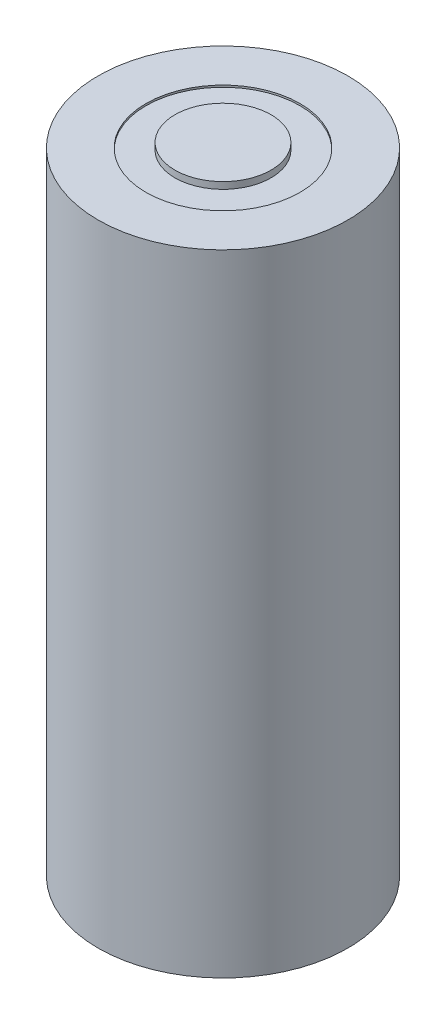
ISO-10303-21;
HEADER;
FILE_DESCRIPTION(('STEP AP214'),'2;1');
FILE_NAME('part.step','',(''),(''),'','','');
FILE_SCHEMA(('AUTOMOTIVE_DESIGN { 1 0 10303 214 1 1 1 1 }'));
ENDSEC;
DATA;
#1=APPLICATION_CONTEXT('core data for automotive mechanical design processes');
#2=APPLICATION_PROTOCOL_DEFINITION('international standard','automotive_design',2000,#1);
#3=PRODUCT_CONTEXT('',#1,'mechanical');
#4=PRODUCT('Part','Part','',(#3));
#5=PRODUCT_RELATED_PRODUCT_CATEGORY('part','',(#4));
#6=PRODUCT_DEFINITION_FORMATION('','',#4);
#7=PRODUCT_DEFINITION_CONTEXT('part definition',#1,'design');
#8=PRODUCT_DEFINITION('design','',#6,#7);
#9=PRODUCT_DEFINITION_SHAPE('','',#8);
#10=(LENGTH_UNIT() NAMED_UNIT(*) SI_UNIT(.MILLI.,.METRE.));
#11=(NAMED_UNIT(*) PLANE_ANGLE_UNIT() SI_UNIT($,.RADIAN.));
#12=(NAMED_UNIT(*) SI_UNIT($,.STERADIAN.) SOLID_ANGLE_UNIT());
#13=UNCERTAINTY_MEASURE_WITH_UNIT(LENGTH_MEASURE(1.E-05),#10,'distance_accuracy_value','');
#14=(GEOMETRIC_REPRESENTATION_CONTEXT(3) GLOBAL_UNCERTAINTY_ASSIGNED_CONTEXT((#13)) GLOBAL_UNIT_ASSIGNED_CONTEXT((#10,
#11,#12)) REPRESENTATION_CONTEXT('',''));
#15=CARTESIAN_POINT('',(0.,0.,0.));
#16=DIRECTION('',(0.,0.,1.));
#17=DIRECTION('',(1.,0.,0.));
#18=AXIS2_PLACEMENT_3D('',#15,#16,#17);
#19=CARTESIAN_POINT('',(0.,65.9,0.));
#20=DIRECTION('',(0.,-1.,0.));
#21=DIRECTION('',(0.,0.,-1.));
#22=AXIS2_PLACEMENT_3D('',#19,#20,#21);
#23=CYLINDRICAL_SURFACE('',#22,13.05);
#24=CARTESIAN_POINT('',(0.,65.9,0.));
#25=DIRECTION('',(0.,1.,0.));
#26=DIRECTION('',(0.,0.,1.));
#27=AXIS2_PLACEMENT_3D('',#24,#25,#26);
#28=CIRCLE('',#27,13.05);
#29=CARTESIAN_POINT('',(0.,65.9,13.05));
#30=VERTEX_POINT('',#29);
#31=EDGE_CURVE('E10',#30,#30,#28,.T.);
#32=ORIENTED_EDGE('',*,*,#31,.F.);
#33=EDGE_LOOP('',(#32));
#34=FACE_BOUND('',#33,.T.);
#35=CARTESIAN_POINT('',(0.,0.,0.));
#36=DIRECTION('',(0.,1.,0.));
#37=DIRECTION('',(0.,0.,1.));
#38=AXIS2_PLACEMENT_3D('',#35,#36,#37);
#39=CIRCLE('',#38,13.05);
#40=CARTESIAN_POINT('',(0.,0.,13.05));
#41=VERTEX_POINT('',#40);
#42=EDGE_CURVE('E36',#41,#41,#39,.T.);
#43=ORIENTED_EDGE('',*,*,#42,.T.);
#44=EDGE_LOOP('',(#43));
#45=FACE_BOUND('',#44,.T.);
#46=ADVANCED_FACE('F33',(#34,#45),#23,.T.);
#47=CARTESIAN_POINT('',(0.,65.9,0.));
#48=DIRECTION('',(0.,1.,0.));
#49=DIRECTION('',(0.,0.,1.));
#50=AXIS2_PLACEMENT_3D('',#47,#48,#49);
#51=PLANE('',#50);
#52=CARTESIAN_POINT('',(0.,65.9,0.));
#53=DIRECTION('',(0.,1.,0.));
#54=DIRECTION('',(0.,0.,1.));
#55=AXIS2_PLACEMENT_3D('',#52,#53,#54);
#56=CIRCLE('',#55,8.04830878102376);
#57=CARTESIAN_POINT('',(0.,65.9,8.04830878102376));
#58=VERTEX_POINT('',#57);
#59=EDGE_CURVE('E54',#58,#58,#56,.T.);
#60=ORIENTED_EDGE('',*,*,#59,.F.);
#61=EDGE_LOOP('',(#60));
#62=FACE_BOUND('',#61,.T.);
#63=ORIENTED_EDGE('',*,*,#31,.T.);
#64=EDGE_LOOP('',(#63));
#65=FACE_BOUND('',#64,.T.);
#66=ADVANCED_FACE('F79',(#62,#65),#51,.T.);
#67=CARTESIAN_POINT('',(0.,0.,0.));
#68=DIRECTION('',(0.,1.,0.));
#69=DIRECTION('',(0.,0.,1.));
#70=AXIS2_PLACEMENT_3D('',#67,#68,#69);
#71=PLANE('',#70);
#72=CARTESIAN_POINT('',(0.,0.,0.));
#73=DIRECTION('',(0.,-1.,0.));
#74=DIRECTION('',(0.,0.,-1.));
#75=AXIS2_PLACEMENT_3D('',#72,#73,#74);
#76=CIRCLE('',#75,10.9781947014455);
#77=CARTESIAN_POINT('',(0.,0.,-10.9781947014455));
#78=VERTEX_POINT('',#77);
#79=EDGE_CURVE('E45',#78,#78,#76,.T.);
#80=ORIENTED_EDGE('',*,*,#79,.F.);
#81=EDGE_LOOP('',(#80));
#82=FACE_BOUND('',#81,.T.);
#83=ORIENTED_EDGE('',*,*,#42,.F.);
#84=EDGE_LOOP('',(#83));
#85=FACE_BOUND('',#84,.T.);
#86=ADVANCED_FACE('F81',(#82,#85),#71,.F.);
#87=CARTESIAN_POINT('',(0.,0.5,0.));
#88=DIRECTION('',(0.,-1.,0.));
#89=DIRECTION('',(0.,0.,-1.));
#90=AXIS2_PLACEMENT_3D('',#87,#88,#89);
#91=CYLINDRICAL_SURFACE('',#90,10.9781947014455);
#92=CARTESIAN_POINT('',(0.,0.5,0.));
#93=DIRECTION('',(0.,-1.,0.));
#94=DIRECTION('',(0.,0.,-1.));
#95=AXIS2_PLACEMENT_3D('',#92,#93,#94);
#96=CIRCLE('',#95,10.9781947014455);
#97=CARTESIAN_POINT('',(0.,0.5,-10.9781947014455));
#98=VERTEX_POINT('',#97);
#99=EDGE_CURVE('E43',#98,#98,#96,.T.);
#100=ORIENTED_EDGE('',*,*,#99,.F.);
#101=EDGE_LOOP('',(#100));
#102=FACE_BOUND('',#101,.T.);
#103=ORIENTED_EDGE('',*,*,#79,.T.);
#104=EDGE_LOOP('',(#103));
#105=FACE_BOUND('',#104,.T.);
#106=ADVANCED_FACE('F87',(#102,#105),#91,.F.);
#107=CARTESIAN_POINT('',(0.,0.5,0.));
#108=DIRECTION('',(0.,-1.,0.));
#109=DIRECTION('',(0.,0.,-1.));
#110=AXIS2_PLACEMENT_3D('',#107,#108,#109);
#111=PLANE('',#110);
#112=ORIENTED_EDGE('',*,*,#99,.T.);
#113=EDGE_LOOP('',(#112));
#114=FACE_BOUND('',#113,.T.);
#115=ADVANCED_FACE('F75',(#114),#111,.T.);
#116=CARTESIAN_POINT('',(0.,65.7,0.));
#117=DIRECTION('',(0.,1.,0.));
#118=DIRECTION('',(0.,0.,1.));
#119=AXIS2_PLACEMENT_3D('',#116,#117,#118);
#120=CYLINDRICAL_SURFACE('',#119,8.04830878102376);
#121=CARTESIAN_POINT('',(0.,65.7,0.));
#122=DIRECTION('',(0.,1.,0.));
#123=DIRECTION('',(0.,0.,1.));
#124=AXIS2_PLACEMENT_3D('',#121,#122,#123);
#125=CIRCLE('',#124,8.04830878102376);
#126=CARTESIAN_POINT('',(0.,65.7,8.04830878102376));
#127=VERTEX_POINT('',#126);
#128=EDGE_CURVE('E53',#127,#127,#125,.T.);
#129=ORIENTED_EDGE('',*,*,#128,.F.);
#130=EDGE_LOOP('',(#129));
#131=FACE_BOUND('',#130,.T.);
#132=ORIENTED_EDGE('',*,*,#59,.T.);
#133=EDGE_LOOP('',(#132));
#134=FACE_BOUND('',#133,.T.);
#135=ADVANCED_FACE('F69',(#131,#134),#120,.F.);
#136=CARTESIAN_POINT('',(0.,65.7,0.));
#137=DIRECTION('',(0.,1.,0.));
#138=DIRECTION('',(0.,0.,1.));
#139=AXIS2_PLACEMENT_3D('',#136,#137,#138);
#140=PLANE('',#139);
#141=CARTESIAN_POINT('',(0.,65.7,0.));
#142=DIRECTION('',(0.,1.,0.));
#143=DIRECTION('',(0.,0.,1.));
#144=AXIS2_PLACEMENT_3D('',#141,#142,#143);
#145=CIRCLE('',#144,5.02170690928381);
#146=CARTESIAN_POINT('',(0.,65.7,5.02170690928381));
#147=VERTEX_POINT('',#146);
#148=EDGE_CURVE('E57',#147,#147,#145,.T.);
#149=ORIENTED_EDGE('',*,*,#148,.F.);
#150=EDGE_LOOP('',(#149));
#151=FACE_BOUND('',#150,.T.);
#152=ORIENTED_EDGE('',*,*,#128,.T.);
#153=EDGE_LOOP('',(#152));
#154=FACE_BOUND('',#153,.T.);
#155=ADVANCED_FACE('F65',(#151,#154),#140,.T.);
#156=CARTESIAN_POINT('',(0.,66.4,0.));
#157=DIRECTION('',(0.,1.,0.));
#158=DIRECTION('',(0.,0.,1.));
#159=AXIS2_PLACEMENT_3D('',#156,#157,#158);
#160=PLANE('',#159);
#161=CARTESIAN_POINT('',(0.,66.4,0.));
#162=DIRECTION('',(0.,1.,0.));
#163=DIRECTION('',(0.,0.,1.));
#164=AXIS2_PLACEMENT_3D('',#161,#162,#163);
#165=CIRCLE('',#164,5.02170690928381);
#166=CARTESIAN_POINT('',(0.,66.4,5.02170690928381));
#167=VERTEX_POINT('',#166);
#168=EDGE_CURVE('E48',#167,#167,#165,.T.);
#169=ORIENTED_EDGE('',*,*,#168,.T.);
#170=EDGE_LOOP('',(#169));
#171=FACE_BOUND('',#170,.T.);
#172=ADVANCED_FACE('F68',(#171),#160,.T.);
#173=CARTESIAN_POINT('',(0.,66.4,0.));
#174=DIRECTION('',(0.,-1.,0.));
#175=DIRECTION('',(0.,0.,-1.));
#176=AXIS2_PLACEMENT_3D('',#173,#174,#175);
#177=CYLINDRICAL_SURFACE('',#176,5.02170690928381);
#178=ORIENTED_EDGE('',*,*,#168,.F.);
#179=EDGE_LOOP('',(#178));
#180=FACE_BOUND('',#179,.T.);
#181=ORIENTED_EDGE('',*,*,#148,.T.);
#182=EDGE_LOOP('',(#181));
#183=FACE_BOUND('',#182,.T.);
#184=ADVANCED_FACE('F63',(#180,#183),#177,.T.);
#185=CLOSED_SHELL('',(#46,#66,#86,#106,#115,#135,#155,#172,#184));
#186=MANIFOLD_SOLID_BREP('B2',#185);
#187=ADVANCED_BREP_SHAPE_REPRESENTATION('',(#18,#186),#14);
#188=SHAPE_DEFINITION_REPRESENTATION(#9,#187);
ENDSEC;
END-ISO-10303-21;
